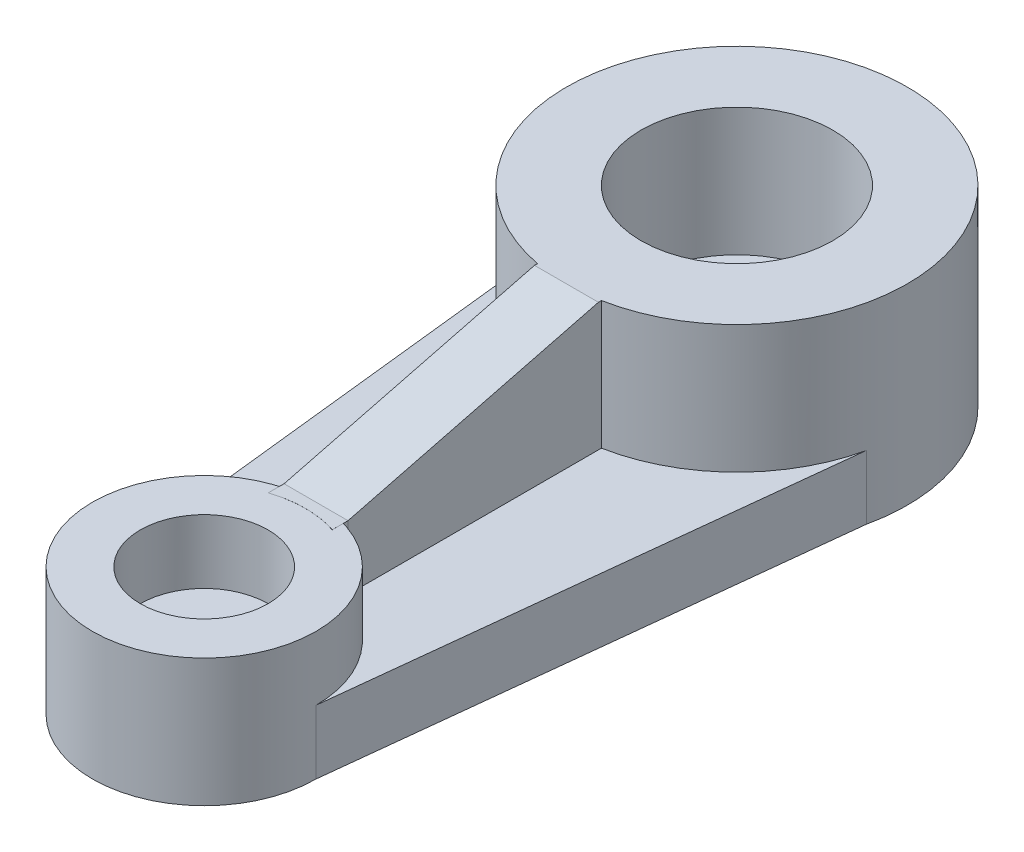
ISO-10303-21;
HEADER;
FILE_DESCRIPTION(('STEP AP214'),'2;1');
FILE_NAME('part.step','',(''),(''),'','','');
FILE_SCHEMA(('AUTOMOTIVE_DESIGN { 1 0 10303 214 1 1 1 1 }'));
ENDSEC;
DATA;
#1=APPLICATION_CONTEXT('core data for automotive mechanical design processes');
#2=APPLICATION_PROTOCOL_DEFINITION('international standard','automotive_design',2000,#1);
#3=PRODUCT_CONTEXT('',#1,'mechanical');
#4=PRODUCT('Part','Part','',(#3));
#5=PRODUCT_RELATED_PRODUCT_CATEGORY('part','',(#4));
#6=PRODUCT_DEFINITION_FORMATION('','',#4);
#7=PRODUCT_DEFINITION_CONTEXT('part definition',#1,'design');
#8=PRODUCT_DEFINITION('design','',#6,#7);
#9=PRODUCT_DEFINITION_SHAPE('','',#8);
#10=(LENGTH_UNIT() NAMED_UNIT(*) SI_UNIT(.MILLI.,.METRE.));
#11=(NAMED_UNIT(*) PLANE_ANGLE_UNIT() SI_UNIT($,.RADIAN.));
#12=(NAMED_UNIT(*) SI_UNIT($,.STERADIAN.) SOLID_ANGLE_UNIT());
#13=UNCERTAINTY_MEASURE_WITH_UNIT(LENGTH_MEASURE(1.E-05),#10,'distance_accuracy_value','');
#14=(GEOMETRIC_REPRESENTATION_CONTEXT(3) GLOBAL_UNCERTAINTY_ASSIGNED_CONTEXT((#13)) GLOBAL_UNIT_ASSIGNED_CONTEXT((#10,
#11,#12)) REPRESENTATION_CONTEXT('',''));
#15=CARTESIAN_POINT('',(0.,0.,0.));
#16=DIRECTION('',(0.,0.,1.));
#17=DIRECTION('',(1.,0.,0.));
#18=AXIS2_PLACEMENT_3D('',#15,#16,#17);
#19=CARTESIAN_POINT('',(6.,12.2188460532778,25.1235046982195));
#20=DIRECTION('',(-1.,0.,0.));
#21=DIRECTION('',(0.,0.,1.));
#22=AXIS2_PLACEMENT_3D('',#19,#20,#21);
#23=PLANE('',#22);
#24=DIRECTION('',(0.,-0.00475060182184504,-0.999988715827499));
#25=VECTOR('',#24,1.);
#26=CARTESIAN_POINT('',(6.,24.2188460532778,25.0664968330708));
#27=LINE('',#26,#25);
#28=CARTESIAN_POINT('',(6.,24.0141201053026,-18.0277563773199));
#29=VERTEX_POINT('',#28);
#30=CARTESIAN_POINT('',(6.,24.,-21.));
#31=VERTEX_POINT('',#30);
#32=EDGE_CURVE('E109',#29,#31,#27,.T.);
#33=ORIENTED_EDGE('',*,*,#32,.F.);
#34=DIRECTION('',(0.,-1.,0.));
#35=VECTOR('',#34,1.);
#36=CARTESIAN_POINT('',(6.,12.,-18.0277563773199));
#37=LINE('',#36,#35);
#38=CARTESIAN_POINT('',(6.,12.0138492805785,-18.0277563773199));
#39=VERTEX_POINT('',#38);
#40=EDGE_CURVE('E117',#29,#39,#37,.T.);
#41=ORIENTED_EDGE('',*,*,#40,.T.);
#42=DIRECTION('',(0.,-0.00475060182184504,-0.999988715827499));
#43=VECTOR('',#42,1.);
#44=CARTESIAN_POINT('',(6.,12.2188460532778,25.1235046982195));
#45=LINE('',#44,#43);
#46=CARTESIAN_POINT('',(6.,12.,-20.9429921348513));
#47=VERTEX_POINT('',#46);
#48=EDGE_CURVE('E115',#39,#47,#45,.T.);
#49=ORIENTED_EDGE('',*,*,#48,.T.);
#50=DIRECTION('',(0.,0.999988715827499,-0.00475060182184504));
#51=VECTOR('',#50,1.);
#52=CARTESIAN_POINT('',(6.,12.,-20.9429921348513));
#53=LINE('',#52,#51);
#54=EDGE_CURVE('E116',#47,#31,#53,.T.);
#55=ORIENTED_EDGE('',*,*,#54,.T.);
#56=EDGE_LOOP('',(#33,#41,#49,#55));
#57=FACE_BOUND('',#56,.T.);
#58=ADVANCED_FACE('F50',(#57),#23,.F.);
#59=CARTESIAN_POINT('',(6.,24.2188460532778,25.0664968330708));
#60=DIRECTION('',(0.,-0.999988715827499,0.00475060182184504));
#61=DIRECTION('',(0.,-0.00475060182184504,-0.999988715827499));
#62=AXIS2_PLACEMENT_3D('',#59,#60,#61);
#63=PLANE('',#62);
#64=DIRECTION('',(0.,-0.00475060182184504,-0.999988715827499));
#65=VECTOR('',#64,1.);
#66=CARTESIAN_POINT('',(-6.,24.2188460532778,25.0664968330708));
#67=LINE('',#66,#65);
#68=CARTESIAN_POINT('',(-6.,24.0141201053026,-18.0277563773199));
#69=VERTEX_POINT('',#68);
#70=CARTESIAN_POINT('',(-6.,24.,-21.));
#71=VERTEX_POINT('',#70);
#72=EDGE_CURVE('E91',#69,#71,#67,.T.);
#73=ORIENTED_EDGE('',*,*,#72,.F.);
#74=CARTESIAN_POINT('',(0.,24.0997637640103,0.));
#75=DIRECTION('',(0.,-0.999988715827499,0.00475060182184504));
#76=DIRECTION('',(0.,-0.00475060182184504,-0.999988715827499));
#77=AXIS2_PLACEMENT_3D('',#74,#75,#76);
#78=ELLIPSE('',#77,19.0002144016969,19.);
#79=EDGE_CURVE('E54',#69,#29,#78,.T.);
#80=ORIENTED_EDGE('',*,*,#79,.T.);
#81=ORIENTED_EDGE('',*,*,#32,.T.);
#82=DIRECTION('',(-1.,0.,0.));
#83=VECTOR('',#82,1.);
#84=CARTESIAN_POINT('',(6.,24.,-21.));
#85=LINE('',#84,#83);
#86=EDGE_CURVE('E104',#31,#71,#85,.T.);
#87=ORIENTED_EDGE('',*,*,#86,.T.);
#88=EDGE_LOOP('',(#73,#80,#81,#87));
#89=FACE_BOUND('',#88,.T.);
#90=ADVANCED_FACE('F107',(#89),#63,.F.);
#91=CARTESIAN_POINT('',(-6.,24.2188460532778,25.0664968330708));
#92=DIRECTION('',(1.,0.,0.));
#93=DIRECTION('',(0.,0.,-1.));
#94=AXIS2_PLACEMENT_3D('',#91,#92,#93);
#95=PLANE('',#94);
#96=DIRECTION('',(0.,-0.00475060182184504,-0.999988715827499));
#97=VECTOR('',#96,1.);
#98=CARTESIAN_POINT('',(-6.,12.2188460532778,25.1235046982195));
#99=LINE('',#98,#97);
#100=CARTESIAN_POINT('',(-6.,12.0138492805785,-18.0277563773199));
#101=VERTEX_POINT('',#100);
#102=CARTESIAN_POINT('',(-6.,12.,-20.9429921348513));
#103=VERTEX_POINT('',#102);
#104=EDGE_CURVE('E60',#101,#103,#99,.T.);
#105=ORIENTED_EDGE('',*,*,#104,.F.);
#106=DIRECTION('',(0.,-1.,0.));
#107=VECTOR('',#106,1.);
#108=CARTESIAN_POINT('',(-6.,12.,-18.0277563773199));
#109=LINE('',#108,#107);
#110=EDGE_CURVE('E96',#101,#69,#109,.F.);
#111=ORIENTED_EDGE('',*,*,#110,.T.);
#112=ORIENTED_EDGE('',*,*,#72,.T.);
#113=DIRECTION('',(0.,-0.999988715827499,0.00475060182184504));
#114=VECTOR('',#113,1.);
#115=CARTESIAN_POINT('',(-6.,24.,-21.));
#116=LINE('',#115,#114);
#117=EDGE_CURVE('E94',#71,#103,#116,.T.);
#118=ORIENTED_EDGE('',*,*,#117,.T.);
#119=EDGE_LOOP('',(#105,#111,#112,#118));
#120=FACE_BOUND('',#119,.T.);
#121=ADVANCED_FACE('F93',(#120),#95,.F.);
#122=CARTESIAN_POINT('',(-6.,12.2188460532778,25.1235046982195));
#123=DIRECTION('',(0.,0.999988715827499,-0.00475060182184504));
#124=DIRECTION('',(0.,0.00475060182184504,0.999988715827499));
#125=AXIS2_PLACEMENT_3D('',#122,#123,#124);
#126=PLANE('',#125);
#127=ORIENTED_EDGE('',*,*,#48,.F.);
#128=CARTESIAN_POINT('',(0.,12.0994929392862,0.));
#129=DIRECTION('',(0.,0.999988715827499,-0.00475060182184504));
#130=DIRECTION('',(0.,-0.00475060182184504,-0.999988715827499));
#131=AXIS2_PLACEMENT_3D('',#128,#129,#130);
#132=ELLIPSE('',#131,19.0002144016969,19.);
#133=EDGE_CURVE('E105',#39,#101,#132,.T.);
#134=ORIENTED_EDGE('',*,*,#133,.T.);
#135=ORIENTED_EDGE('',*,*,#104,.T.);
#136=DIRECTION('',(1.,0.,0.));
#137=VECTOR('',#136,1.);
#138=CARTESIAN_POINT('',(-6.,12.,-20.9429921348513));
#139=LINE('',#138,#137);
#140=EDGE_CURVE('E13',#103,#47,#139,.T.);
#141=ORIENTED_EDGE('',*,*,#140,.T.);
#142=EDGE_LOOP('',(#127,#134,#135,#141));
#143=FACE_BOUND('',#142,.T.);
#144=ADVANCED_FACE('F120',(#143),#126,.F.);
#145=CARTESIAN_POINT('',(0.,-0.0992198752958534,-20.8855129102633));
#146=DIRECTION('',(0.,0.00475060182184504,0.999988715827499));
#147=DIRECTION('',(0.,-0.999988715827499,0.00475060182184504));
#148=AXIS2_PLACEMENT_3D('',#145,#146,#147);
#149=PLANE('',#148);
#150=ORIENTED_EDGE('',*,*,#86,.F.);
#151=ORIENTED_EDGE('',*,*,#54,.F.);
#152=ORIENTED_EDGE('',*,*,#140,.F.);
#153=ORIENTED_EDGE('',*,*,#117,.F.);
#154=EDGE_LOOP('',(#150,#151,#152,#153));
#155=FACE_BOUND('',#154,.T.);
#156=ADVANCED_FACE('F102',(#155),#149,.F.);
#157=CARTESIAN_POINT('',(0.,12.,0.));
#158=DIRECTION('',(0.,-1.,0.));
#159=DIRECTION('',(0.,0.,-1.));
#160=AXIS2_PLACEMENT_3D('',#157,#158,#159);
#161=CYLINDRICAL_SURFACE('',#160,19.);
#162=ORIENTED_EDGE('',*,*,#110,.F.);
#163=ORIENTED_EDGE('',*,*,#133,.F.);
#164=ORIENTED_EDGE('',*,*,#40,.F.);
#165=ORIENTED_EDGE('',*,*,#79,.F.);
#166=EDGE_LOOP('',(#162,#163,#164,#165));
#167=FACE_BOUND('',#166,.T.);
#168=ADVANCED_FACE('F52',(#167),#161,.F.);
#169=CLOSED_SHELL('',(#58,#90,#121,#144,#156,#168));
#170=MANIFOLD_SOLID_BREP('B2',#169);
#171=CARTESIAN_POINT('',(0.,12.,0.));
#172=DIRECTION('',(0.,-1.,0.));
#173=DIRECTION('',(0.,0.,-1.));
#174=AXIS2_PLACEMENT_3D('',#171,#172,#173);
#175=PLANE('',#174);
#176=DIRECTION('',(0.,0.,-1.));
#177=VECTOR('',#176,1.);
#178=CARTESIAN_POINT('',(-6.,12.,-68.));
#179=LINE('',#178,#177);
#180=CARTESIAN_POINT('',(-6.,12.,-20.9429921348513));
#181=VERTEX_POINT('',#180);
#182=CARTESIAN_POINT('',(-6.,12.,-68.5675327089966));
#183=VERTEX_POINT('',#182);
#184=EDGE_CURVE('E190',#181,#183,#179,.T.);
#185=ORIENTED_EDGE('',*,*,#184,.T.);
#186=CARTESIAN_POINT('',(0.,12.,-100.));
#187=DIRECTION('',(0.,-1.,0.));
#188=DIRECTION('',(0.,0.,-1.));
#189=AXIS2_PLACEMENT_3D('',#186,#187,#188);
#190=CIRCLE('',#189,32.);
#191=CARTESIAN_POINT('',(-31.2348582155914,12.,-93.044165596285));
#192=VERTEX_POINT('',#191);
#193=EDGE_CURVE('E343',#183,#192,#190,.T.);
#194=ORIENTED_EDGE('',*,*,#193,.T.);
#195=DIRECTION('',(-0.109340479152898,0.,-0.994004355935433));
#196=VECTOR('',#195,1.);
#197=CARTESIAN_POINT('',(-21.,12.,0.));
#198=LINE('',#197,#196);
#199=CARTESIAN_POINT('',(-21.,12.,0.));
#200=VERTEX_POINT('',#199);
#201=EDGE_CURVE('E313',#200,#192,#198,.T.);
#202=ORIENTED_EDGE('',*,*,#201,.F.);
#203=CARTESIAN_POINT('',(0.,12.,0.));
#204=DIRECTION('',(0.,-1.,0.));
#205=DIRECTION('',(0.,0.,-1.));
#206=AXIS2_PLACEMENT_3D('',#203,#204,#205);
#207=CIRCLE('',#206,21.);
#208=CARTESIAN_POINT('',(-1.54631188301636,12.,-20.9429921348513));
#209=VERTEX_POINT('',#208);
#210=EDGE_CURVE('E183',#209,#200,#207,.F.);
#211=ORIENTED_EDGE('',*,*,#210,.F.);
#212=DIRECTION('',(-1.,0.,0.));
#213=VECTOR('',#212,1.);
#214=CARTESIAN_POINT('',(6.,12.,-20.9429921348513));
#215=LINE('',#214,#213);
#216=EDGE_CURVE('E287',#209,#181,#215,.T.);
#217=ORIENTED_EDGE('',*,*,#216,.T.);
#218=EDGE_LOOP('',(#185,#194,#202,#211,#217));
#219=FACE_BOUND('',#218,.T.);
#220=ADVANCED_FACE('F175',(#219),#175,.F.);
#221=CARTESIAN_POINT('',(0.,36.,-100.));
#222=DIRECTION('',(0.,-1.,0.));
#223=DIRECTION('',(0.,0.,-1.));
#224=AXIS2_PLACEMENT_3D('',#221,#222,#223);
#225=CYLINDRICAL_SURFACE('',#224,32.);
#226=DIRECTION('',(0.,-1.,0.));
#227=VECTOR('',#226,1.);
#228=CARTESIAN_POINT('',(-6.,36.,-68.5675327089966));
#229=LINE('',#228,#227);
#230=CARTESIAN_POINT('',(-6.,36.,-68.5675327089966));
#231=VERTEX_POINT('',#230);
#232=EDGE_CURVE('E197',#183,#231,#229,.F.);
#233=ORIENTED_EDGE('',*,*,#232,.T.);
#234=CARTESIAN_POINT('',(0.,36.,-100.));
#235=DIRECTION('',(0.,1.,0.));
#236=DIRECTION('',(0.,0.,1.));
#237=AXIS2_PLACEMENT_3D('',#234,#235,#236);
#238=CIRCLE('',#237,32.);
#239=CARTESIAN_POINT('',(6.,36.,-68.5675327089966));
#240=VERTEX_POINT('',#239);
#241=EDGE_CURVE('E280',#240,#231,#238,.T.);
#242=ORIENTED_EDGE('',*,*,#241,.F.);
#243=DIRECTION('',(0.,-1.,0.));
#244=VECTOR('',#243,1.);
#245=CARTESIAN_POINT('',(6.,36.,-68.5675327089966));
#246=LINE('',#245,#244);
#247=CARTESIAN_POINT('',(6.,12.,-68.5675327089966));
#248=VERTEX_POINT('',#247);
#249=EDGE_CURVE('E302',#240,#248,#246,.T.);
#250=ORIENTED_EDGE('',*,*,#249,.T.);
#251=CARTESIAN_POINT('',(31.2348582155914,12.,-93.044165596285));
#252=VERTEX_POINT('',#251);
#253=EDGE_CURVE('E339',#252,#248,#190,.T.);
#254=ORIENTED_EDGE('',*,*,#253,.F.);
#255=DIRECTION('',(0.,-1.,0.));
#256=VECTOR('',#255,1.);
#257=CARTESIAN_POINT('',(31.2348582155914,12.,-93.044165596285));
#258=LINE('',#257,#256);
#259=CARTESIAN_POINT('',(31.2348582155914,0.,-93.044165596285));
#260=VERTEX_POINT('',#259);
#261=EDGE_CURVE('E332',#252,#260,#258,.T.);
#262=ORIENTED_EDGE('',*,*,#261,.T.);
#263=CARTESIAN_POINT('',(0.,0.,-100.));
#264=DIRECTION('',(0.,1.,0.));
#265=DIRECTION('',(0.,0.,1.));
#266=AXIS2_PLACEMENT_3D('',#263,#264,#265);
#267=CIRCLE('',#266,32.);
#268=CARTESIAN_POINT('',(-31.2348582155914,0.,-93.044165596285));
#269=VERTEX_POINT('',#268);
#270=EDGE_CURVE('E346',#260,#269,#267,.T.);
#271=ORIENTED_EDGE('',*,*,#270,.T.);
#272=DIRECTION('',(0.,-1.,0.));
#273=VECTOR('',#272,1.);
#274=CARTESIAN_POINT('',(-31.2348582155914,12.,-93.044165596285));
#275=LINE('',#274,#273);
#276=EDGE_CURVE('E335',#192,#269,#275,.T.);
#277=ORIENTED_EDGE('',*,*,#276,.F.);
#278=ORIENTED_EDGE('',*,*,#193,.F.);
#279=EDGE_LOOP('',(#233,#242,#250,#254,#262,#271,#277,#278));
#280=FACE_BOUND('',#279,.T.);
#281=ADVANCED_FACE('F177',(#280),#225,.T.);
#282=CARTESIAN_POINT('',(6.,12.,-20.9429921348513));
#283=VERTEX_POINT('',#282);
#284=CARTESIAN_POINT('',(1.54631188301636,12.,-20.9429921348513));
#285=VERTEX_POINT('',#284);
#286=EDGE_CURVE('E291',#283,#285,#215,.T.);
#287=ORIENTED_EDGE('',*,*,#286,.T.);
#288=CARTESIAN_POINT('',(21.,12.,0.));
#289=VERTEX_POINT('',#288);
#290=EDGE_CURVE('E48',#289,#285,#207,.F.);
#291=ORIENTED_EDGE('',*,*,#290,.F.);
#292=DIRECTION('',(-0.109340479152898,0.,0.994004355935433));
#293=VECTOR('',#292,1.);
#294=CARTESIAN_POINT('',(21.,12.,0.));
#295=LINE('',#294,#293);
#296=EDGE_CURVE('E316',#252,#289,#295,.T.);
#297=ORIENTED_EDGE('',*,*,#296,.F.);
#298=ORIENTED_EDGE('',*,*,#253,.T.);
#299=DIRECTION('',(0.,0.,1.));
#300=VECTOR('',#299,1.);
#301=CARTESIAN_POINT('',(6.,12.,-132.002));
#302=LINE('',#301,#300);
#303=EDGE_CURVE('E269',#248,#283,#302,.T.);
#304=ORIENTED_EDGE('',*,*,#303,.T.);
#305=EDGE_LOOP('',(#287,#291,#297,#298,#304));
#306=FACE_BOUND('',#305,.T.);
#307=ADVANCED_FACE('F373',(#306),#175,.F.);
#308=CARTESIAN_POINT('',(0.,12.,0.));
#309=DIRECTION('',(0.,-1.,0.));
#310=DIRECTION('',(0.,0.,-1.));
#311=AXIS2_PLACEMENT_3D('',#308,#309,#310);
#312=CYLINDRICAL_SURFACE('',#311,21.);
#313=ORIENTED_EDGE('',*,*,#290,.T.);
#314=CARTESIAN_POINT('',(0.,-4396.44267650737,0.));
#315=DIRECTION('',(0.,-0.00475060182184504,-0.999988715827499));
#316=DIRECTION('',(0.,-0.999988715827499,0.00475060182184504));
#317=AXIS2_PLACEMENT_3D('',#314,#315,#316);
#318=ELLIPSE('',#317,4420.49255810793,21.);
#319=CARTESIAN_POINT('',(0.,24.,-21.));
#320=VERTEX_POINT('',#319);
#321=EDGE_CURVE('E301',#285,#320,#318,.F.);
#322=ORIENTED_EDGE('',*,*,#321,.T.);
#323=CARTESIAN_POINT('',(0.,24.,0.));
#324=DIRECTION('',(0.,1.,0.));
#325=DIRECTION('',(0.,0.,1.));
#326=AXIS2_PLACEMENT_3D('',#323,#324,#325);
#327=CIRCLE('',#326,21.);
#328=EDGE_CURVE('E309',#320,#320,#327,.T.);
#329=ORIENTED_EDGE('',*,*,#328,.F.);
#330=EDGE_CURVE('E298',#320,#209,#318,.F.);
#331=ORIENTED_EDGE('',*,*,#330,.T.);
#332=ORIENTED_EDGE('',*,*,#210,.T.);
#333=DIRECTION('',(0.,-1.,0.));
#334=VECTOR('',#333,1.);
#335=CARTESIAN_POINT('',(-21.,12.,0.));
#336=LINE('',#335,#334);
#337=CARTESIAN_POINT('',(-21.,0.,0.));
#338=VERTEX_POINT('',#337);
#339=EDGE_CURVE('E320',#200,#338,#336,.T.);
#340=ORIENTED_EDGE('',*,*,#339,.T.);
#341=CARTESIAN_POINT('',(0.,0.,0.));
#342=DIRECTION('',(0.,-1.,0.));
#343=DIRECTION('',(0.,0.,-1.));
#344=AXIS2_PLACEMENT_3D('',#341,#342,#343);
#345=CIRCLE('',#344,21.);
#346=CARTESIAN_POINT('',(21.,0.,0.));
#347=VERTEX_POINT('',#346);
#348=EDGE_CURVE('E321',#347,#338,#345,.T.);
#349=ORIENTED_EDGE('',*,*,#348,.F.);
#350=DIRECTION('',(0.,-1.,0.));
#351=VECTOR('',#350,1.);
#352=CARTESIAN_POINT('',(21.,12.,0.));
#353=LINE('',#352,#351);
#354=EDGE_CURVE('E329',#289,#347,#353,.T.);
#355=ORIENTED_EDGE('',*,*,#354,.F.);
#356=EDGE_LOOP('',(#313,#322,#329,#331,#332,#340,#349,#355));
#357=FACE_BOUND('',#356,.T.);
#358=ADVANCED_FACE('F382',(#357),#312,.T.);
#359=CARTESIAN_POINT('',(0.,36.,-100.));
#360=DIRECTION('',(0.,-1.,0.));
#361=DIRECTION('',(0.,0.,-1.));
#362=AXIS2_PLACEMENT_3D('',#359,#360,#361);
#363=CYLINDRICAL_SURFACE('',#362,18.);
#364=CARTESIAN_POINT('',(0.,36.,-100.));
#365=DIRECTION('',(0.,1.,0.));
#366=DIRECTION('',(0.,0.,1.));
#367=AXIS2_PLACEMENT_3D('',#364,#365,#366);
#368=CIRCLE('',#367,18.);
#369=CARTESIAN_POINT('',(0.,36.,-82.));
#370=VERTEX_POINT('',#369);
#371=EDGE_CURVE('E342',#370,#370,#368,.T.);
#372=ORIENTED_EDGE('',*,*,#371,.T.);
#373=EDGE_LOOP('',(#372));
#374=FACE_BOUND('',#373,.T.);
#375=CARTESIAN_POINT('',(0.,12.,-100.));
#376=DIRECTION('',(0.,-1.,0.));
#377=DIRECTION('',(0.,0.,-1.));
#378=AXIS2_PLACEMENT_3D('',#375,#376,#377);
#379=CIRCLE('',#378,18.);
#380=CARTESIAN_POINT('',(0.,12.,-118.));
#381=VERTEX_POINT('',#380);
#382=EDGE_CURVE('E331',#381,#381,#379,.T.);
#383=ORIENTED_EDGE('',*,*,#382,.T.);
#384=EDGE_LOOP('',(#383));
#385=FACE_BOUND('',#384,.T.);
#386=ADVANCED_FACE('F387',(#374,#385),#363,.F.);
#387=CARTESIAN_POINT('',(0.,36.,-100.));
#388=DIRECTION('',(0.,1.,0.));
#389=DIRECTION('',(0.,0.,1.));
#390=AXIS2_PLACEMENT_3D('',#387,#388,#389);
#391=PLANE('',#390);
#392=ORIENTED_EDGE('',*,*,#241,.T.);
#393=DIRECTION('',(0.,0.,1.));
#394=VECTOR('',#393,1.);
#395=CARTESIAN_POINT('',(-6.,36.,-132.002));
#396=LINE('',#395,#394);
#397=CARTESIAN_POINT('',(-6.,36.,-68.));
#398=VERTEX_POINT('',#397);
#399=EDGE_CURVE('E275',#231,#398,#396,.T.);
#400=ORIENTED_EDGE('',*,*,#399,.T.);
#401=DIRECTION('',(1.,0.,0.));
#402=VECTOR('',#401,1.);
#403=CARTESIAN_POINT('',(-6.,36.,-68.));
#404=LINE('',#403,#402);
#405=CARTESIAN_POINT('',(6.,36.,-68.));
#406=VERTEX_POINT('',#405);
#407=EDGE_CURVE('E256',#398,#406,#404,.T.);
#408=ORIENTED_EDGE('',*,*,#407,.T.);
#409=DIRECTION('',(0.,0.,1.));
#410=VECTOR('',#409,1.);
#411=CARTESIAN_POINT('',(6.,36.,-132.002));
#412=LINE('',#411,#410);
#413=EDGE_CURVE('E303',#240,#406,#412,.T.);
#414=ORIENTED_EDGE('',*,*,#413,.F.);
#415=EDGE_LOOP('',(#392,#400,#408,#414));
#416=FACE_BOUND('',#415,.T.);
#417=ORIENTED_EDGE('',*,*,#371,.F.);
#418=EDGE_LOOP('',(#417));
#419=FACE_BOUND('',#418,.T.);
#420=ADVANCED_FACE('F278',(#416,#419),#391,.T.);
#421=CARTESIAN_POINT('',(0.,0.,-100.));
#422=DIRECTION('',(0.,1.,0.));
#423=DIRECTION('',(0.,0.,1.));
#424=AXIS2_PLACEMENT_3D('',#421,#422,#423);
#425=PLANE('',#424);
#426=DIRECTION('',(-0.109340479152898,0.,0.994004355935433));
#427=VECTOR('',#426,1.);
#428=CARTESIAN_POINT('',(21.,0.,0.));
#429=LINE('',#428,#427);
#430=EDGE_CURVE('E317',#260,#347,#429,.T.);
#431=ORIENTED_EDGE('',*,*,#430,.T.);
#432=ORIENTED_EDGE('',*,*,#348,.T.);
#433=DIRECTION('',(-0.109340479152898,0.,-0.994004355935433));
#434=VECTOR('',#433,1.);
#435=CARTESIAN_POINT('',(-21.,0.,0.));
#436=LINE('',#435,#434);
#437=EDGE_CURVE('E324',#338,#269,#436,.T.);
#438=ORIENTED_EDGE('',*,*,#437,.T.);
#439=ORIENTED_EDGE('',*,*,#270,.F.);
#440=EDGE_LOOP('',(#431,#432,#438,#439));
#441=FACE_BOUND('',#440,.T.);
#442=ADVANCED_FACE('F391',(#441),#425,.F.);
#443=ORIENTED_EDGE('',*,*,#382,.F.);
#444=EDGE_LOOP('',(#443));
#445=FACE_BOUND('',#444,.T.);
#446=ADVANCED_FACE('F380',(#445),#175,.F.);
#447=CARTESIAN_POINT('',(21.,12.,0.));
#448=DIRECTION('',(0.994004355935433,0.,0.109340479152898));
#449=DIRECTION('',(0.109340479152898,0.,-0.994004355935433));
#450=AXIS2_PLACEMENT_3D('',#447,#448,#449);
#451=PLANE('',#450);
#452=ORIENTED_EDGE('',*,*,#430,.F.);
#453=ORIENTED_EDGE('',*,*,#261,.F.);
#454=ORIENTED_EDGE('',*,*,#296,.T.);
#455=ORIENTED_EDGE('',*,*,#354,.T.);
#456=EDGE_LOOP('',(#452,#453,#454,#455));
#457=FACE_BOUND('',#456,.T.);
#458=ADVANCED_FACE('F367',(#457),#451,.T.);
#459=CARTESIAN_POINT('',(-21.,12.,0.));
#460=DIRECTION('',(-0.994004355935433,0.,0.109340479152898));
#461=DIRECTION('',(0.109340479152898,0.,0.994004355935433));
#462=AXIS2_PLACEMENT_3D('',#459,#460,#461);
#463=PLANE('',#462);
#464=ORIENTED_EDGE('',*,*,#437,.F.);
#465=ORIENTED_EDGE('',*,*,#339,.F.);
#466=ORIENTED_EDGE('',*,*,#201,.T.);
#467=ORIENTED_EDGE('',*,*,#276,.T.);
#468=EDGE_LOOP('',(#464,#465,#466,#467));
#469=FACE_BOUND('',#468,.T.);
#470=ADVANCED_FACE('F358',(#469),#463,.T.);
#471=CARTESIAN_POINT('',(0.,24.,0.));
#472=DIRECTION('',(0.,-1.,0.));
#473=DIRECTION('',(0.,0.,-1.));
#474=AXIS2_PLACEMENT_3D('',#471,#472,#473);
#475=CYLINDRICAL_SURFACE('',#474,12.);
#476=CARTESIAN_POINT('',(0.,24.,0.));
#477=DIRECTION('',(0.,1.,0.));
#478=DIRECTION('',(0.,0.,1.));
#479=AXIS2_PLACEMENT_3D('',#476,#477,#478);
#480=CIRCLE('',#479,12.);
#481=CARTESIAN_POINT('',(0.,24.,12.));
#482=VERTEX_POINT('',#481);
#483=EDGE_CURVE('E268',#482,#482,#480,.T.);
#484=ORIENTED_EDGE('',*,*,#483,.T.);
#485=EDGE_LOOP('',(#484));
#486=FACE_BOUND('',#485,.T.);
#487=CARTESIAN_POINT('',(0.,12.,0.));
#488=DIRECTION('',(0.,-1.,0.));
#489=DIRECTION('',(0.,0.,-1.));
#490=AXIS2_PLACEMENT_3D('',#487,#488,#489);
#491=CIRCLE('',#490,12.);
#492=CARTESIAN_POINT('',(0.,12.,-12.));
#493=VERTEX_POINT('',#492);
#494=EDGE_CURVE('E312',#493,#493,#491,.F.);
#495=ORIENTED_EDGE('',*,*,#494,.F.);
#496=EDGE_LOOP('',(#495));
#497=FACE_BOUND('',#496,.T.);
#498=ADVANCED_FACE('F355',(#486,#497),#475,.F.);
#499=CARTESIAN_POINT('',(0.,24.,0.));
#500=DIRECTION('',(0.,1.,0.));
#501=DIRECTION('',(0.,0.,1.));
#502=AXIS2_PLACEMENT_3D('',#499,#500,#501);
#503=PLANE('',#502);
#504=ORIENTED_EDGE('',*,*,#328,.T.);
#505=EDGE_LOOP('',(#504));
#506=FACE_BOUND('',#505,.T.);
#507=ORIENTED_EDGE('',*,*,#483,.F.);
#508=EDGE_LOOP('',(#507));
#509=FACE_BOUND('',#508,.T.);
#510=ADVANCED_FACE('F357',(#506,#509),#503,.T.);
#511=ORIENTED_EDGE('',*,*,#494,.T.);
#512=EDGE_LOOP('',(#511));
#513=FACE_BOUND('',#512,.T.);
#514=ADVANCED_FACE('F353',(#513),#175,.F.);
#515=CARTESIAN_POINT('',(6.,36.,-132.002));
#516=DIRECTION('',(-1.,0.,0.));
#517=DIRECTION('',(0.,0.,1.));
#518=AXIS2_PLACEMENT_3D('',#515,#516,#517);
#519=PLANE('',#518);
#520=ORIENTED_EDGE('',*,*,#249,.F.);
#521=ORIENTED_EDGE('',*,*,#413,.T.);
#522=DIRECTION('',(0.,-0.24738324526582,0.968917710624463));
#523=VECTOR('',#522,1.);
#524=CARTESIAN_POINT('',(6.,36.,-68.));
#525=LINE('',#524,#523);
#526=CARTESIAN_POINT('',(6.,24.,-21.));
#527=VERTEX_POINT('',#526);
#528=EDGE_CURVE('E263',#406,#527,#525,.T.);
#529=ORIENTED_EDGE('',*,*,#528,.T.);
#530=DIRECTION('',(0.,-0.999988715827499,0.00475060182184504));
#531=VECTOR('',#530,1.);
#532=CARTESIAN_POINT('',(6.,12.,-20.9429921348513));
#533=LINE('',#532,#531);
#534=EDGE_CURVE('E285',#527,#283,#533,.T.);
#535=ORIENTED_EDGE('',*,*,#534,.T.);
#536=ORIENTED_EDGE('',*,*,#303,.F.);
#537=EDGE_LOOP('',(#520,#521,#529,#535,#536));
#538=FACE_BOUND('',#537,.T.);
#539=ADVANCED_FACE('F379',(#538),#519,.F.);
#540=CARTESIAN_POINT('',(6.,12.,-20.9429921348513));
#541=DIRECTION('',(0.,-0.00475060182184504,-0.999988715827499));
#542=DIRECTION('',(0.,0.999988715827499,-0.00475060182184504));
#543=AXIS2_PLACEMENT_3D('',#540,#541,#542);
#544=PLANE('',#543);
#545=ORIENTED_EDGE('',*,*,#321,.F.);
#546=ORIENTED_EDGE('',*,*,#286,.F.);
#547=ORIENTED_EDGE('',*,*,#534,.F.);
#548=DIRECTION('',(-1.,0.,0.));
#549=VECTOR('',#548,1.);
#550=CARTESIAN_POINT('',(6.,24.,-21.));
#551=LINE('',#550,#549);
#552=EDGE_CURVE('E295',#527,#320,#551,.T.);
#553=ORIENTED_EDGE('',*,*,#552,.T.);
#554=EDGE_LOOP('',(#545,#546,#547,#553));
#555=FACE_BOUND('',#554,.T.);
#556=ADVANCED_FACE('F477',(#555),#544,.F.);
#557=CARTESIAN_POINT('',(6.,36.,-68.));
#558=DIRECTION('',(0.,-0.968917710624463,-0.24738324526582));
#559=DIRECTION('',(0.,0.24738324526582,-0.968917710624463));
#560=AXIS2_PLACEMENT_3D('',#557,#558,#559);
#561=PLANE('',#560);
#562=DIRECTION('',(0.,-0.24738324526582,0.968917710624463));
#563=VECTOR('',#562,1.);
#564=CARTESIAN_POINT('',(-6.,36.,-68.));
#565=LINE('',#564,#563);
#566=CARTESIAN_POINT('',(-6.,24.,-21.));
#567=VERTEX_POINT('',#566);
#568=EDGE_CURVE('E260',#398,#567,#565,.T.);
#569=ORIENTED_EDGE('',*,*,#568,.T.);
#570=EDGE_CURVE('E294',#320,#567,#551,.T.);
#571=ORIENTED_EDGE('',*,*,#570,.F.);
#572=ORIENTED_EDGE('',*,*,#552,.F.);
#573=ORIENTED_EDGE('',*,*,#528,.F.);
#574=ORIENTED_EDGE('',*,*,#407,.F.);
#575=EDGE_LOOP('',(#569,#571,#572,#573,#574));
#576=FACE_BOUND('',#575,.T.);
#577=ADVANCED_FACE('F258',(#576),#561,.F.);
#578=ORIENTED_EDGE('',*,*,#330,.F.);
#579=ORIENTED_EDGE('',*,*,#570,.T.);
#580=DIRECTION('',(0.,-0.999988715827499,0.00475060182184504));
#581=VECTOR('',#580,1.);
#582=CARTESIAN_POINT('',(-6.,12.,-20.9429921348513));
#583=LINE('',#582,#581);
#584=EDGE_CURVE('E276',#567,#181,#583,.T.);
#585=ORIENTED_EDGE('',*,*,#584,.T.);
#586=ORIENTED_EDGE('',*,*,#216,.F.);
#587=EDGE_LOOP('',(#578,#579,#585,#586));
#588=FACE_BOUND('',#587,.T.);
#589=ADVANCED_FACE('F485',(#588),#544,.F.);
#590=CARTESIAN_POINT('',(-6.,0.,0.));
#591=DIRECTION('',(1.,0.,0.));
#592=DIRECTION('',(0.,0.,-1.));
#593=AXIS2_PLACEMENT_3D('',#590,#591,#592);
#594=PLANE('',#593);
#595=ORIENTED_EDGE('',*,*,#568,.F.);
#596=ORIENTED_EDGE('',*,*,#399,.F.);
#597=ORIENTED_EDGE('',*,*,#232,.F.);
#598=ORIENTED_EDGE('',*,*,#184,.F.);
#599=ORIENTED_EDGE('',*,*,#584,.F.);
#600=EDGE_LOOP('',(#595,#596,#597,#598,#599));
#601=FACE_BOUND('',#600,.T.);
#602=ADVANCED_FACE('F274',(#601),#594,.F.);
#603=CLOSED_SHELL('',(#220,#281,#307,#358,#386,#420,#442,#446,#458,#470,#498,#510,#514,#539,
#556,#577,#589,#602));
#604=MANIFOLD_SOLID_BREP('B7',#603);
#605=ADVANCED_BREP_SHAPE_REPRESENTATION('',(#18,#170,#604),#14);
#606=SHAPE_DEFINITION_REPRESENTATION(#9,#605);
ENDSEC;
END-ISO-10303-21;
